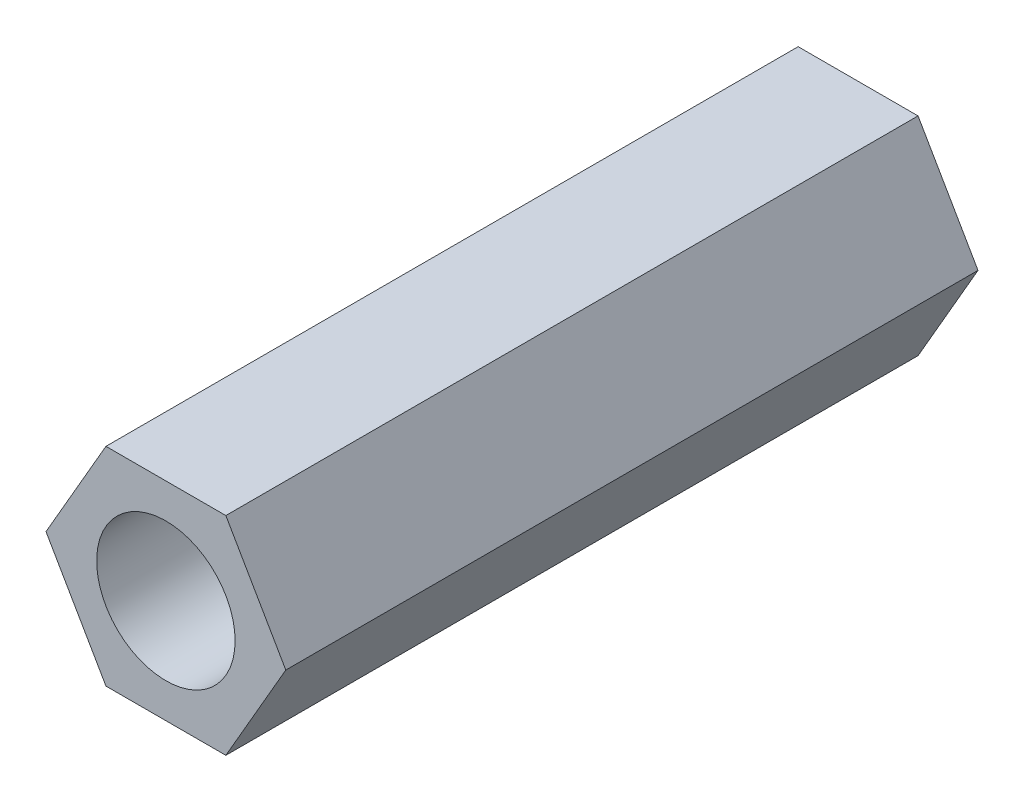
ISO-10303-21;
HEADER;
FILE_DESCRIPTION(('STEP AP214'),'2;1');
FILE_NAME('part.step','',(''),(''),'','','');
FILE_SCHEMA(('AUTOMOTIVE_DESIGN { 1 0 10303 214 1 1 1 1 }'));
ENDSEC;
DATA;
#1=APPLICATION_CONTEXT('core data for automotive mechanical design processes');
#2=APPLICATION_PROTOCOL_DEFINITION('international standard','automotive_design',2000,#1);
#3=PRODUCT_CONTEXT('',#1,'mechanical');
#4=PRODUCT('Part','Part','',(#3));
#5=PRODUCT_RELATED_PRODUCT_CATEGORY('part','',(#4));
#6=PRODUCT_DEFINITION_FORMATION('','',#4);
#7=PRODUCT_DEFINITION_CONTEXT('part definition',#1,'design');
#8=PRODUCT_DEFINITION('design','',#6,#7);
#9=PRODUCT_DEFINITION_SHAPE('','',#8);
#10=(LENGTH_UNIT() NAMED_UNIT(*) SI_UNIT(.MILLI.,.METRE.));
#11=(NAMED_UNIT(*) PLANE_ANGLE_UNIT() SI_UNIT($,.RADIAN.));
#12=(NAMED_UNIT(*) SI_UNIT($,.STERADIAN.) SOLID_ANGLE_UNIT());
#13=UNCERTAINTY_MEASURE_WITH_UNIT(LENGTH_MEASURE(1.E-05),#10,'distance_accuracy_value','');
#14=(GEOMETRIC_REPRESENTATION_CONTEXT(3) GLOBAL_UNCERTAINTY_ASSIGNED_CONTEXT((#13)) GLOBAL_UNIT_ASSIGNED_CONTEXT((#10,
#11,#12)) REPRESENTATION_CONTEXT('',''));
#15=CARTESIAN_POINT('',(0.,0.,0.));
#16=DIRECTION('',(0.,0.,1.));
#17=DIRECTION('',(1.,0.,0.));
#18=AXIS2_PLACEMENT_3D('',#15,#16,#17);
#19=CARTESIAN_POINT('',(0.,0.,10.));
#20=DIRECTION('',(0.,0.,1.));
#21=DIRECTION('',(1.,0.,0.));
#22=AXIS2_PLACEMENT_3D('',#19,#20,#21);
#23=PLANE('',#22);
#24=DIRECTION('',(0.5,0.866025403784438,0.));
#25=VECTOR('',#24,1.);
#26=CARTESIAN_POINT('',(0.86602540378444,-1.5,10.));
#27=LINE('',#26,#25);
#28=CARTESIAN_POINT('',(0.86602540378444,-1.5,10.));
#29=VERTEX_POINT('',#28);
#30=CARTESIAN_POINT('',(1.73205080756888,0.,10.));
#31=VERTEX_POINT('',#30);
#32=EDGE_CURVE('E145',#29,#31,#27,.T.);
#33=ORIENTED_EDGE('',*,*,#32,.T.);
#34=DIRECTION('',(-0.5,0.866025403784438,0.));
#35=VECTOR('',#34,1.);
#36=CARTESIAN_POINT('',(1.73205080756888,0.,10.));
#37=LINE('',#36,#35);
#38=CARTESIAN_POINT('',(0.866025403784438,1.5,10.));
#39=VERTEX_POINT('',#38);
#40=EDGE_CURVE('E93',#31,#39,#37,.T.);
#41=ORIENTED_EDGE('',*,*,#40,.T.);
#42=DIRECTION('',(-1.,0.,0.));
#43=VECTOR('',#42,1.);
#44=CARTESIAN_POINT('',(0.866025403784438,1.5,10.));
#45=LINE('',#44,#43);
#46=CARTESIAN_POINT('',(-0.866025403784439,1.5,10.));
#47=VERTEX_POINT('',#46);
#48=EDGE_CURVE('E106',#39,#47,#45,.T.);
#49=ORIENTED_EDGE('',*,*,#48,.T.);
#50=DIRECTION('',(-0.5,-0.866025403784438,0.));
#51=VECTOR('',#50,1.);
#52=CARTESIAN_POINT('',(-0.866025403784439,1.5,10.));
#53=LINE('',#52,#51);
#54=CARTESIAN_POINT('',(-1.73205080756888,0.,10.));
#55=VERTEX_POINT('',#54);
#56=EDGE_CURVE('E100',#47,#55,#53,.T.);
#57=ORIENTED_EDGE('',*,*,#56,.T.);
#58=DIRECTION('',(0.5,-0.866025403784438,0.));
#59=VECTOR('',#58,1.);
#60=CARTESIAN_POINT('',(-1.73205080756888,0.,10.));
#61=LINE('',#60,#59);
#62=CARTESIAN_POINT('',(-0.866025403784439,-1.5,10.));
#63=VERTEX_POINT('',#62);
#64=EDGE_CURVE('E104',#55,#63,#61,.T.);
#65=ORIENTED_EDGE('',*,*,#64,.T.);
#66=DIRECTION('',(1.,0.,0.));
#67=VECTOR('',#66,1.);
#68=CARTESIAN_POINT('',(-0.866025403784439,-1.5,10.));
#69=LINE('',#68,#67);
#70=EDGE_CURVE('E56',#63,#29,#69,.T.);
#71=ORIENTED_EDGE('',*,*,#70,.T.);
#72=EDGE_LOOP('',(#33,#41,#49,#57,#65,#71));
#73=FACE_BOUND('',#72,.T.);
#74=CARTESIAN_POINT('',(0.,0.,10.));
#75=DIRECTION('',(0.,0.,1.));
#76=DIRECTION('',(1.,0.,0.));
#77=AXIS2_PLACEMENT_3D('',#74,#75,#76);
#78=CIRCLE('',#77,1.);
#79=CARTESIAN_POINT('',(1.,0.,10.));
#80=VERTEX_POINT('',#79);
#81=EDGE_CURVE('E133',#80,#80,#78,.T.);
#82=ORIENTED_EDGE('',*,*,#81,.F.);
#83=EDGE_LOOP('',(#82));
#84=FACE_BOUND('',#83,.T.);
#85=ADVANCED_FACE('F38',(#73,#84),#23,.T.);
#86=CARTESIAN_POINT('',(0.,0.,0.));
#87=DIRECTION('',(0.,0.,1.));
#88=DIRECTION('',(1.,0.,0.));
#89=AXIS2_PLACEMENT_3D('',#86,#87,#88);
#90=PLANE('',#89);
#91=DIRECTION('',(0.5,0.866025403784438,0.));
#92=VECTOR('',#91,1.);
#93=CARTESIAN_POINT('',(0.86602540378444,-1.5,0.));
#94=LINE('',#93,#92);
#95=CARTESIAN_POINT('',(0.86602540378444,-1.5,0.));
#96=VERTEX_POINT('',#95);
#97=CARTESIAN_POINT('',(1.73205080756888,0.,0.));
#98=VERTEX_POINT('',#97);
#99=EDGE_CURVE('E128',#96,#98,#94,.T.);
#100=ORIENTED_EDGE('',*,*,#99,.F.);
#101=DIRECTION('',(1.,0.,0.));
#102=VECTOR('',#101,1.);
#103=CARTESIAN_POINT('',(-0.866025403784439,-1.5,0.));
#104=LINE('',#103,#102);
#105=CARTESIAN_POINT('',(-0.866025403784439,-1.5,0.));
#106=VERTEX_POINT('',#105);
#107=EDGE_CURVE('E85',#106,#96,#104,.T.);
#108=ORIENTED_EDGE('',*,*,#107,.F.);
#109=DIRECTION('',(0.5,-0.866025403784438,0.));
#110=VECTOR('',#109,1.);
#111=CARTESIAN_POINT('',(-1.73205080756888,0.,0.));
#112=LINE('',#111,#110);
#113=CARTESIAN_POINT('',(-1.73205080756888,0.,0.));
#114=VERTEX_POINT('',#113);
#115=EDGE_CURVE('E79',#114,#106,#112,.T.);
#116=ORIENTED_EDGE('',*,*,#115,.F.);
#117=DIRECTION('',(-0.5,-0.866025403784438,0.));
#118=VECTOR('',#117,1.);
#119=CARTESIAN_POINT('',(-0.866025403784439,1.5,0.));
#120=LINE('',#119,#118);
#121=CARTESIAN_POINT('',(-0.866025403784439,1.5,0.));
#122=VERTEX_POINT('',#121);
#123=EDGE_CURVE('E115',#122,#114,#120,.T.);
#124=ORIENTED_EDGE('',*,*,#123,.F.);
#125=DIRECTION('',(-1.,0.,0.));
#126=VECTOR('',#125,1.);
#127=CARTESIAN_POINT('',(0.866025403784438,1.5,0.));
#128=LINE('',#127,#126);
#129=CARTESIAN_POINT('',(0.866025403784438,1.5,0.));
#130=VERTEX_POINT('',#129);
#131=EDGE_CURVE('E136',#130,#122,#128,.T.);
#132=ORIENTED_EDGE('',*,*,#131,.F.);
#133=DIRECTION('',(-0.5,0.866025403784438,0.));
#134=VECTOR('',#133,1.);
#135=CARTESIAN_POINT('',(1.73205080756888,0.,0.));
#136=LINE('',#135,#134);
#137=EDGE_CURVE('E132',#98,#130,#136,.T.);
#138=ORIENTED_EDGE('',*,*,#137,.F.);
#139=EDGE_LOOP('',(#100,#108,#116,#124,#132,#138));
#140=FACE_BOUND('',#139,.T.);
#141=CARTESIAN_POINT('',(0.,0.,0.));
#142=DIRECTION('',(0.,0.,1.));
#143=DIRECTION('',(1.,0.,0.));
#144=AXIS2_PLACEMENT_3D('',#141,#142,#143);
#145=CIRCLE('',#144,1.);
#146=CARTESIAN_POINT('',(1.,0.,0.));
#147=VERTEX_POINT('',#146);
#148=EDGE_CURVE('E242',#147,#147,#145,.T.);
#149=ORIENTED_EDGE('',*,*,#148,.T.);
#150=EDGE_LOOP('',(#149));
#151=FACE_BOUND('',#150,.T.);
#152=ADVANCED_FACE('F158',(#140,#151),#90,.F.);
#153=CARTESIAN_POINT('',(0.86602540378444,-1.5,10.));
#154=DIRECTION('',(-0.866025403784439,0.5,0.));
#155=DIRECTION('',(-0.5,-0.866025403784439,0.));
#156=AXIS2_PLACEMENT_3D('',#153,#154,#155);
#157=PLANE('',#156);
#158=ORIENTED_EDGE('',*,*,#99,.T.);
#159=DIRECTION('',(0.,0.,-1.));
#160=VECTOR('',#159,1.);
#161=CARTESIAN_POINT('',(1.73205080756888,0.,10.));
#162=LINE('',#161,#160);
#163=EDGE_CURVE('E11',#31,#98,#162,.T.);
#164=ORIENTED_EDGE('',*,*,#163,.F.);
#165=ORIENTED_EDGE('',*,*,#32,.F.);
#166=DIRECTION('',(0.,0.,-1.));
#167=VECTOR('',#166,1.);
#168=CARTESIAN_POINT('',(0.86602540378444,-1.5,10.));
#169=LINE('',#168,#167);
#170=EDGE_CURVE('E124',#29,#96,#169,.T.);
#171=ORIENTED_EDGE('',*,*,#170,.T.);
#172=EDGE_LOOP('',(#158,#164,#165,#171));
#173=FACE_BOUND('',#172,.T.);
#174=ADVANCED_FACE('F40',(#173),#157,.F.);
#175=CARTESIAN_POINT('',(1.73205080756888,0.,10.));
#176=DIRECTION('',(-0.866025403784438,-0.5,0.));
#177=DIRECTION('',(0.5,-0.866025403784438,0.));
#178=AXIS2_PLACEMENT_3D('',#175,#176,#177);
#179=PLANE('',#178);
#180=ORIENTED_EDGE('',*,*,#137,.T.);
#181=DIRECTION('',(0.,0.,-1.));
#182=VECTOR('',#181,1.);
#183=CARTESIAN_POINT('',(0.866025403784438,1.5,10.));
#184=LINE('',#183,#182);
#185=EDGE_CURVE('E48',#39,#130,#184,.T.);
#186=ORIENTED_EDGE('',*,*,#185,.F.);
#187=ORIENTED_EDGE('',*,*,#40,.F.);
#188=ORIENTED_EDGE('',*,*,#163,.T.);
#189=EDGE_LOOP('',(#180,#186,#187,#188));
#190=FACE_BOUND('',#189,.T.);
#191=ADVANCED_FACE('F183',(#190),#179,.F.);
#192=CARTESIAN_POINT('',(0.866025403784438,1.5,10.));
#193=DIRECTION('',(0.,-1.,0.));
#194=DIRECTION('',(1.,0.,0.));
#195=AXIS2_PLACEMENT_3D('',#192,#193,#194);
#196=PLANE('',#195);
#197=ORIENTED_EDGE('',*,*,#131,.T.);
#198=DIRECTION('',(0.,0.,-1.));
#199=VECTOR('',#198,1.);
#200=CARTESIAN_POINT('',(-0.866025403784439,1.5,10.));
#201=LINE('',#200,#199);
#202=EDGE_CURVE('E117',#47,#122,#201,.T.);
#203=ORIENTED_EDGE('',*,*,#202,.F.);
#204=ORIENTED_EDGE('',*,*,#48,.F.);
#205=ORIENTED_EDGE('',*,*,#185,.T.);
#206=EDGE_LOOP('',(#197,#203,#204,#205));
#207=FACE_BOUND('',#206,.T.);
#208=ADVANCED_FACE('F155',(#207),#196,.F.);
#209=CARTESIAN_POINT('',(-0.866025403784439,1.5,10.));
#210=DIRECTION('',(0.866025403784439,-0.5,0.));
#211=DIRECTION('',(0.5,0.866025403784439,0.));
#212=AXIS2_PLACEMENT_3D('',#209,#210,#211);
#213=PLANE('',#212);
#214=ORIENTED_EDGE('',*,*,#123,.T.);
#215=DIRECTION('',(0.,0.,-1.));
#216=VECTOR('',#215,1.);
#217=CARTESIAN_POINT('',(-1.73205080756888,0.,10.));
#218=LINE('',#217,#216);
#219=EDGE_CURVE('E112',#55,#114,#218,.T.);
#220=ORIENTED_EDGE('',*,*,#219,.F.);
#221=ORIENTED_EDGE('',*,*,#56,.F.);
#222=ORIENTED_EDGE('',*,*,#202,.T.);
#223=EDGE_LOOP('',(#214,#220,#221,#222));
#224=FACE_BOUND('',#223,.T.);
#225=ADVANCED_FACE('F113',(#224),#213,.F.);
#226=CARTESIAN_POINT('',(-1.73205080756888,0.,10.));
#227=DIRECTION('',(0.866025403784438,0.5,0.));
#228=DIRECTION('',(-0.5,0.866025403784438,0.));
#229=AXIS2_PLACEMENT_3D('',#226,#227,#228);
#230=PLANE('',#229);
#231=ORIENTED_EDGE('',*,*,#115,.T.);
#232=DIRECTION('',(0.,0.,-1.));
#233=VECTOR('',#232,1.);
#234=CARTESIAN_POINT('',(-0.866025403784439,-1.5,10.));
#235=LINE('',#234,#233);
#236=EDGE_CURVE('E118',#63,#106,#235,.T.);
#237=ORIENTED_EDGE('',*,*,#236,.F.);
#238=ORIENTED_EDGE('',*,*,#64,.F.);
#239=ORIENTED_EDGE('',*,*,#219,.T.);
#240=EDGE_LOOP('',(#231,#237,#238,#239));
#241=FACE_BOUND('',#240,.T.);
#242=ADVANCED_FACE('F120',(#241),#230,.F.);
#243=CARTESIAN_POINT('',(-0.866025403784439,-1.5,10.));
#244=DIRECTION('',(0.,1.,0.));
#245=DIRECTION('',(-1.,0.,0.));
#246=AXIS2_PLACEMENT_3D('',#243,#244,#245);
#247=PLANE('',#246);
#248=ORIENTED_EDGE('',*,*,#107,.T.);
#249=ORIENTED_EDGE('',*,*,#170,.F.);
#250=ORIENTED_EDGE('',*,*,#70,.F.);
#251=ORIENTED_EDGE('',*,*,#236,.T.);
#252=EDGE_LOOP('',(#248,#249,#250,#251));
#253=FACE_BOUND('',#252,.T.);
#254=ADVANCED_FACE('F163',(#253),#247,.F.);
#255=CARTESIAN_POINT('',(0.,0.,10.));
#256=DIRECTION('',(0.,0.,-1.));
#257=DIRECTION('',(-1.,0.,0.));
#258=AXIS2_PLACEMENT_3D('',#255,#256,#257);
#259=CYLINDRICAL_SURFACE('',#258,1.);
#260=ORIENTED_EDGE('',*,*,#81,.T.);
#261=EDGE_LOOP('',(#260));
#262=FACE_BOUND('',#261,.T.);
#263=ORIENTED_EDGE('',*,*,#148,.F.);
#264=EDGE_LOOP('',(#263));
#265=FACE_BOUND('',#264,.T.);
#266=ADVANCED_FACE('F165',(#262,#265),#259,.F.);
#267=CLOSED_SHELL('',(#85,#152,#174,#191,#208,#225,#242,#254,#266));
#268=MANIFOLD_SOLID_BREP('B2',#267);
#269=ADVANCED_BREP_SHAPE_REPRESENTATION('',(#18,#268),#14);
#270=SHAPE_DEFINITION_REPRESENTATION(#9,#269);
ENDSEC;
END-ISO-10303-21;
